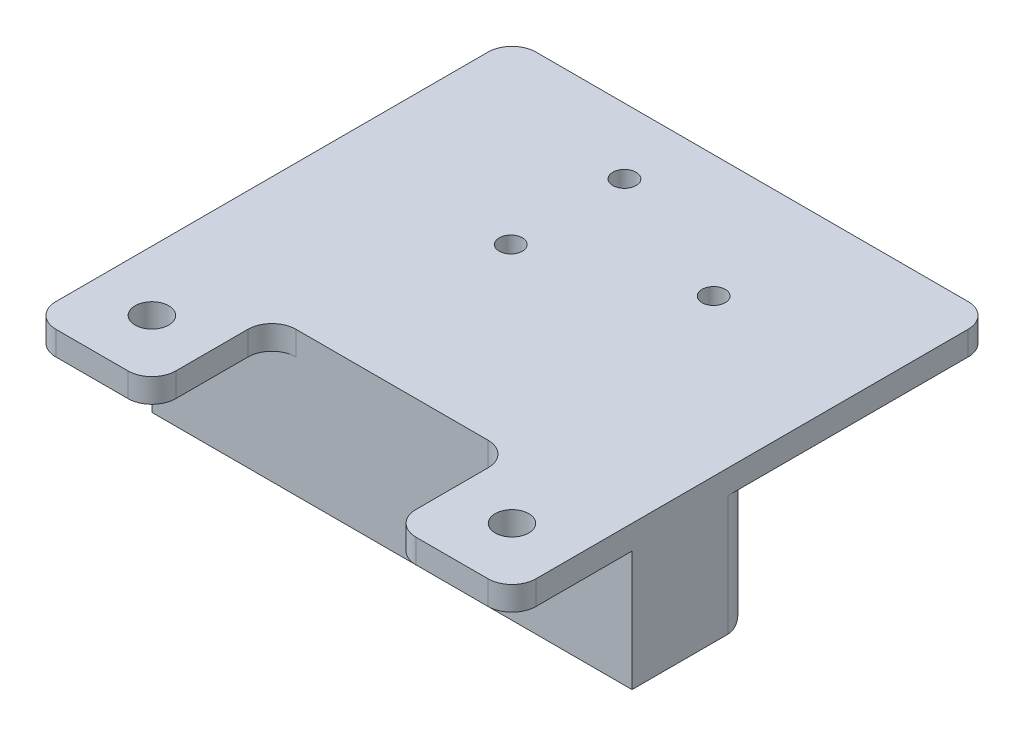
ISO-10303-21;
HEADER;
FILE_DESCRIPTION(('STEP AP214'),'2;1');
FILE_NAME('part.step','',(''),(''),'','','');
FILE_SCHEMA(('AUTOMOTIVE_DESIGN { 1 0 10303 214 1 1 1 1 }'));
ENDSEC;
DATA;
#1=APPLICATION_CONTEXT('core data for automotive mechanical design processes');
#2=APPLICATION_PROTOCOL_DEFINITION('international standard','automotive_design',2000,#1);
#3=PRODUCT_CONTEXT('',#1,'mechanical');
#4=PRODUCT('Part','Part','',(#3));
#5=PRODUCT_RELATED_PRODUCT_CATEGORY('part','',(#4));
#6=PRODUCT_DEFINITION_FORMATION('','',#4);
#7=PRODUCT_DEFINITION_CONTEXT('part definition',#1,'design');
#8=PRODUCT_DEFINITION('design','',#6,#7);
#9=PRODUCT_DEFINITION_SHAPE('','',#8);
#10=(LENGTH_UNIT() NAMED_UNIT(*) SI_UNIT(.MILLI.,.METRE.));
#11=(NAMED_UNIT(*) PLANE_ANGLE_UNIT() SI_UNIT($,.RADIAN.));
#12=(NAMED_UNIT(*) SI_UNIT($,.STERADIAN.) SOLID_ANGLE_UNIT());
#13=UNCERTAINTY_MEASURE_WITH_UNIT(LENGTH_MEASURE(1.E-05),#10,'distance_accuracy_value','');
#14=(GEOMETRIC_REPRESENTATION_CONTEXT(3) GLOBAL_UNCERTAINTY_ASSIGNED_CONTEXT((#13)) GLOBAL_UNIT_ASSIGNED_CONTEXT((#10,
#11,#12)) REPRESENTATION_CONTEXT('',''));
#15=CARTESIAN_POINT('',(0.,0.,0.));
#16=DIRECTION('',(0.,0.,1.));
#17=DIRECTION('',(1.,0.,0.));
#18=AXIS2_PLACEMENT_3D('',#15,#16,#17);
#19=CARTESIAN_POINT('',(0.,0.,0.));
#20=DIRECTION('',(0.,-1.,0.));
#21=DIRECTION('',(0.,0.,-1.));
#22=AXIS2_PLACEMENT_3D('',#19,#20,#21);
#23=PLANE('',#22);
#24=DIRECTION('',(0.,0.,-1.));
#25=VECTOR('',#24,1.);
#26=CARTESIAN_POINT('',(30.,0.,-52.5));
#27=LINE('',#26,#25);
#28=CARTESIAN_POINT('',(30.,0.,4.5));
#29=VERTEX_POINT('',#28);
#30=CARTESIAN_POINT('',(30.,0.,-7.49999999999999));
#31=VERTEX_POINT('',#30);
#32=EDGE_CURVE('E209',#29,#31,#27,.T.);
#33=ORIENTED_EDGE('',*,*,#32,.F.);
#34=CARTESIAN_POINT('',(27.,0.,4.5));
#35=DIRECTION('',(0.,-1.,0.));
#36=DIRECTION('',(0.,0.,-1.));
#37=AXIS2_PLACEMENT_3D('',#34,#35,#36);
#38=CIRCLE('',#37,3.);
#39=CARTESIAN_POINT('',(27.,0.,7.5));
#40=VERTEX_POINT('',#39);
#41=EDGE_CURVE('E340',#29,#40,#38,.T.);
#42=ORIENTED_EDGE('',*,*,#41,.T.);
#43=DIRECTION('',(1.,0.,0.));
#44=VECTOR('',#43,1.);
#45=CARTESIAN_POINT('',(30.,0.,7.5));
#46=LINE('',#45,#44);
#47=CARTESIAN_POINT('',(18.,0.,7.49999999999999));
#48=VERTEX_POINT('',#47);
#49=EDGE_CURVE('E290',#48,#40,#46,.T.);
#50=ORIENTED_EDGE('',*,*,#49,.F.);
#51=CARTESIAN_POINT('',(18.,0.,4.49999999999999));
#52=DIRECTION('',(0.,-1.,0.));
#53=DIRECTION('',(0.,0.,-1.));
#54=AXIS2_PLACEMENT_3D('',#51,#52,#53);
#55=CIRCLE('',#54,3.);
#56=CARTESIAN_POINT('',(15.,0.,4.5));
#57=VERTEX_POINT('',#56);
#58=EDGE_CURVE('E338',#48,#57,#55,.T.);
#59=ORIENTED_EDGE('',*,*,#58,.T.);
#60=DIRECTION('',(0.,0.,1.));
#61=VECTOR('',#60,1.);
#62=CARTESIAN_POINT('',(15.,0.,7.49999999999999));
#63=LINE('',#62,#61);
#64=CARTESIAN_POINT('',(15.,0.,-4.5));
#65=VERTEX_POINT('',#64);
#66=EDGE_CURVE('E287',#65,#57,#63,.T.);
#67=ORIENTED_EDGE('',*,*,#66,.F.);
#68=CARTESIAN_POINT('',(12.,0.,-4.5));
#69=DIRECTION('',(0.,-1.,0.));
#70=DIRECTION('',(0.,0.,-1.));
#71=AXIS2_PLACEMENT_3D('',#68,#69,#70);
#72=CIRCLE('',#71,3.);
#73=CARTESIAN_POINT('',(12.,0.,-7.5));
#74=VERTEX_POINT('',#73);
#75=EDGE_CURVE('E376',#65,#74,#72,.F.);
#76=ORIENTED_EDGE('',*,*,#75,.T.);
#77=DIRECTION('',(-1.,0.,0.));
#78=VECTOR('',#77,1.);
#79=CARTESIAN_POINT('',(-30.,0.,-7.49999999999999));
#80=LINE('',#79,#78);
#81=EDGE_CURVE('E58',#31,#74,#80,.T.);
#82=ORIENTED_EDGE('',*,*,#81,.F.);
#83=EDGE_LOOP('',(#33,#42,#50,#59,#67,#76,#82));
#84=FACE_BOUND('',#83,.T.);
#85=CARTESIAN_POINT('',(22.5,0.,0.));
#86=DIRECTION('',(0.,1.,0.));
#87=DIRECTION('',(0.,0.,-1.));
#88=AXIS2_PLACEMENT_3D('',#85,#86,#87);
#89=CIRCLE('',#88,2.1);
#90=CARTESIAN_POINT('',(22.5,0.,-2.1));
#91=VERTEX_POINT('',#90);
#92=EDGE_CURVE('E239',#91,#91,#89,.T.);
#93=ORIENTED_EDGE('',*,*,#92,.T.);
#94=EDGE_LOOP('',(#93));
#95=FACE_BOUND('',#94,.T.);
#96=ADVANCED_FACE('F41',(#84,#95),#23,.T.);
#97=DIRECTION('',(0.,0.,-1.));
#98=VECTOR('',#97,1.);
#99=CARTESIAN_POINT('',(-15.,0.,-7.5));
#100=LINE('',#99,#98);
#101=CARTESIAN_POINT('',(-15.,0.,4.5));
#102=VERTEX_POINT('',#101);
#103=CARTESIAN_POINT('',(-15.,0.,-4.5));
#104=VERTEX_POINT('',#103);
#105=EDGE_CURVE('E284',#102,#104,#100,.T.);
#106=ORIENTED_EDGE('',*,*,#105,.F.);
#107=CARTESIAN_POINT('',(-18.,0.,4.5));
#108=DIRECTION('',(0.,-1.,0.));
#109=DIRECTION('',(0.,0.,-1.));
#110=AXIS2_PLACEMENT_3D('',#107,#108,#109);
#111=CIRCLE('',#110,3.);
#112=CARTESIAN_POINT('',(-18.,0.,7.5));
#113=VERTEX_POINT('',#112);
#114=EDGE_CURVE('E359',#102,#113,#111,.T.);
#115=ORIENTED_EDGE('',*,*,#114,.T.);
#116=DIRECTION('',(1.,0.,0.));
#117=VECTOR('',#116,1.);
#118=CARTESIAN_POINT('',(-15.,0.,7.5));
#119=LINE('',#118,#117);
#120=CARTESIAN_POINT('',(-27.,0.,7.5));
#121=VERTEX_POINT('',#120);
#122=EDGE_CURVE('E281',#121,#113,#119,.T.);
#123=ORIENTED_EDGE('',*,*,#122,.F.);
#124=CARTESIAN_POINT('',(-27.,0.,4.5));
#125=DIRECTION('',(0.,-1.,0.));
#126=DIRECTION('',(0.,0.,-1.));
#127=AXIS2_PLACEMENT_3D('',#124,#125,#126);
#128=CIRCLE('',#127,3.);
#129=CARTESIAN_POINT('',(-30.,0.,4.5));
#130=VERTEX_POINT('',#129);
#131=EDGE_CURVE('E357',#121,#130,#128,.T.);
#132=ORIENTED_EDGE('',*,*,#131,.T.);
#133=DIRECTION('',(0.,0.,1.));
#134=VECTOR('',#133,1.);
#135=CARTESIAN_POINT('',(-30.,0.,7.5));
#136=LINE('',#135,#134);
#137=CARTESIAN_POINT('',(-30.,0.,-7.49999999999999));
#138=VERTEX_POINT('',#137);
#139=EDGE_CURVE('E251',#138,#130,#136,.T.);
#140=ORIENTED_EDGE('',*,*,#139,.F.);
#141=CARTESIAN_POINT('',(-12.,0.,-7.49999999999999));
#142=VERTEX_POINT('',#141);
#143=EDGE_CURVE('E66',#142,#138,#80,.T.);
#144=ORIENTED_EDGE('',*,*,#143,.F.);
#145=CARTESIAN_POINT('',(-12.,0.,-4.5));
#146=DIRECTION('',(0.,-1.,0.));
#147=DIRECTION('',(0.,0.,-1.));
#148=AXIS2_PLACEMENT_3D('',#145,#146,#147);
#149=CIRCLE('',#148,3.);
#150=EDGE_CURVE('E50',#142,#104,#149,.F.);
#151=ORIENTED_EDGE('',*,*,#150,.T.);
#152=EDGE_LOOP('',(#106,#115,#123,#132,#140,#144,#151));
#153=FACE_BOUND('',#152,.T.);
#154=CARTESIAN_POINT('',(-22.5,0.,0.));
#155=DIRECTION('',(0.,1.,0.));
#156=DIRECTION('',(0.,0.,1.));
#157=AXIS2_PLACEMENT_3D('',#154,#155,#156);
#158=CIRCLE('',#157,2.1);
#159=CARTESIAN_POINT('',(-22.5,0.,2.10000000000001));
#160=VERTEX_POINT('',#159);
#161=EDGE_CURVE('E245',#160,#160,#158,.T.);
#162=ORIENTED_EDGE('',*,*,#161,.T.);
#163=EDGE_LOOP('',(#162));
#164=FACE_BOUND('',#163,.T.);
#165=ADVANCED_FACE('F476',(#153,#164),#23,.T.);
#166=CARTESIAN_POINT('',(0.,3.,0.));
#167=DIRECTION('',(0.,-1.,0.));
#168=DIRECTION('',(0.,0.,-1.));
#169=AXIS2_PLACEMENT_3D('',#166,#167,#168);
#170=PLANE('',#169);
#171=DIRECTION('',(-1.,0.,0.));
#172=VECTOR('',#171,1.);
#173=CARTESIAN_POINT('',(-30.,3.,-52.5));
#174=LINE('',#173,#172);
#175=CARTESIAN_POINT('',(27.,3.,-52.5));
#176=VERTEX_POINT('',#175);
#177=CARTESIAN_POINT('',(-27.,3.,-52.5));
#178=VERTEX_POINT('',#177);
#179=EDGE_CURVE('E276',#176,#178,#174,.T.);
#180=ORIENTED_EDGE('',*,*,#179,.T.);
#181=CARTESIAN_POINT('',(-27.,3.,-49.5));
#182=DIRECTION('',(0.,-1.,0.));
#183=DIRECTION('',(0.,0.,-1.));
#184=AXIS2_PLACEMENT_3D('',#181,#182,#183);
#185=CIRCLE('',#184,3.);
#186=CARTESIAN_POINT('',(-30.,3.,-49.5));
#187=VERTEX_POINT('',#186);
#188=EDGE_CURVE('E336',#178,#187,#185,.F.);
#189=ORIENTED_EDGE('',*,*,#188,.T.);
#190=DIRECTION('',(0.,0.,1.));
#191=VECTOR('',#190,1.);
#192=CARTESIAN_POINT('',(-30.,3.,7.5));
#193=LINE('',#192,#191);
#194=CARTESIAN_POINT('',(-30.,3.,4.5));
#195=VERTEX_POINT('',#194);
#196=EDGE_CURVE('E254',#187,#195,#193,.T.);
#197=ORIENTED_EDGE('',*,*,#196,.T.);
#198=CARTESIAN_POINT('',(-27.,3.,4.5));
#199=DIRECTION('',(0.,-1.,0.));
#200=DIRECTION('',(0.,0.,-1.));
#201=AXIS2_PLACEMENT_3D('',#198,#199,#200);
#202=CIRCLE('',#201,3.);
#203=CARTESIAN_POINT('',(-27.,3.,7.5));
#204=VERTEX_POINT('',#203);
#205=EDGE_CURVE('E326',#195,#204,#202,.F.);
#206=ORIENTED_EDGE('',*,*,#205,.T.);
#207=DIRECTION('',(1.,0.,0.));
#208=VECTOR('',#207,1.);
#209=CARTESIAN_POINT('',(-15.,3.,7.5));
#210=LINE('',#209,#208);
#211=CARTESIAN_POINT('',(-18.,3.,7.5));
#212=VERTEX_POINT('',#211);
#213=EDGE_CURVE('E257',#204,#212,#210,.T.);
#214=ORIENTED_EDGE('',*,*,#213,.T.);
#215=CARTESIAN_POINT('',(-18.,3.,4.5));
#216=DIRECTION('',(0.,-1.,0.));
#217=DIRECTION('',(0.,0.,-1.));
#218=AXIS2_PLACEMENT_3D('',#215,#216,#217);
#219=CIRCLE('',#218,3.);
#220=CARTESIAN_POINT('',(-15.,3.,4.5));
#221=VERTEX_POINT('',#220);
#222=EDGE_CURVE('E328',#212,#221,#219,.F.);
#223=ORIENTED_EDGE('',*,*,#222,.T.);
#224=DIRECTION('',(0.,0.,-1.));
#225=VECTOR('',#224,1.);
#226=CARTESIAN_POINT('',(-15.,3.,-7.5));
#227=LINE('',#226,#225);
#228=CARTESIAN_POINT('',(-15.,3.,-4.5));
#229=VERTEX_POINT('',#228);
#230=EDGE_CURVE('E261',#221,#229,#227,.T.);
#231=ORIENTED_EDGE('',*,*,#230,.T.);
#232=CARTESIAN_POINT('',(-12.,3.,-4.5));
#233=DIRECTION('',(0.,-1.,0.));
#234=DIRECTION('',(0.,0.,-1.));
#235=AXIS2_PLACEMENT_3D('',#232,#233,#234);
#236=CIRCLE('',#235,3.);
#237=CARTESIAN_POINT('',(-12.,3.,-7.5));
#238=VERTEX_POINT('',#237);
#239=EDGE_CURVE('E11',#229,#238,#236,.T.);
#240=ORIENTED_EDGE('',*,*,#239,.T.);
#241=DIRECTION('',(1.,0.,0.));
#242=VECTOR('',#241,1.);
#243=CARTESIAN_POINT('',(15.,3.,-7.5));
#244=LINE('',#243,#242);
#245=CARTESIAN_POINT('',(12.,3.,-7.5));
#246=VERTEX_POINT('',#245);
#247=EDGE_CURVE('E264',#238,#246,#244,.T.);
#248=ORIENTED_EDGE('',*,*,#247,.T.);
#249=CARTESIAN_POINT('',(12.,3.,-4.5));
#250=DIRECTION('',(0.,-1.,0.));
#251=DIRECTION('',(0.,0.,-1.));
#252=AXIS2_PLACEMENT_3D('',#249,#250,#251);
#253=CIRCLE('',#252,3.);
#254=CARTESIAN_POINT('',(15.,3.,-4.5));
#255=VERTEX_POINT('',#254);
#256=EDGE_CURVE('E378',#246,#255,#253,.T.);
#257=ORIENTED_EDGE('',*,*,#256,.T.);
#258=DIRECTION('',(0.,0.,1.));
#259=VECTOR('',#258,1.);
#260=CARTESIAN_POINT('',(15.,3.,7.49999999999999));
#261=LINE('',#260,#259);
#262=CARTESIAN_POINT('',(15.,3.,4.5));
#263=VERTEX_POINT('',#262);
#264=EDGE_CURVE('E267',#255,#263,#261,.T.);
#265=ORIENTED_EDGE('',*,*,#264,.T.);
#266=CARTESIAN_POINT('',(18.,3.,4.49999999999999));
#267=DIRECTION('',(0.,-1.,0.));
#268=DIRECTION('',(0.,0.,-1.));
#269=AXIS2_PLACEMENT_3D('',#266,#267,#268);
#270=CIRCLE('',#269,3.);
#271=CARTESIAN_POINT('',(18.,3.,7.49999999999999));
#272=VERTEX_POINT('',#271);
#273=EDGE_CURVE('E330',#263,#272,#270,.F.);
#274=ORIENTED_EDGE('',*,*,#273,.T.);
#275=DIRECTION('',(1.,0.,0.));
#276=VECTOR('',#275,1.);
#277=CARTESIAN_POINT('',(30.,3.,7.5));
#278=LINE('',#277,#276);
#279=CARTESIAN_POINT('',(27.,3.,7.5));
#280=VERTEX_POINT('',#279);
#281=EDGE_CURVE('E270',#272,#280,#278,.T.);
#282=ORIENTED_EDGE('',*,*,#281,.T.);
#283=CARTESIAN_POINT('',(27.,3.,4.5));
#284=DIRECTION('',(0.,-1.,0.));
#285=DIRECTION('',(0.,0.,-1.));
#286=AXIS2_PLACEMENT_3D('',#283,#284,#285);
#287=CIRCLE('',#286,3.);
#288=CARTESIAN_POINT('',(30.,3.,4.5));
#289=VERTEX_POINT('',#288);
#290=EDGE_CURVE('E332',#280,#289,#287,.F.);
#291=ORIENTED_EDGE('',*,*,#290,.T.);
#292=DIRECTION('',(0.,0.,-1.));
#293=VECTOR('',#292,1.);
#294=CARTESIAN_POINT('',(30.,3.,-52.5));
#295=LINE('',#294,#293);
#296=CARTESIAN_POINT('',(30.,3.,-49.5));
#297=VERTEX_POINT('',#296);
#298=EDGE_CURVE('E273',#289,#297,#295,.T.);
#299=ORIENTED_EDGE('',*,*,#298,.T.);
#300=CARTESIAN_POINT('',(27.,3.,-49.5));
#301=DIRECTION('',(0.,-1.,0.));
#302=DIRECTION('',(0.,0.,-1.));
#303=AXIS2_PLACEMENT_3D('',#300,#301,#302);
#304=CIRCLE('',#303,3.);
#305=EDGE_CURVE('E334',#297,#176,#304,.F.);
#306=ORIENTED_EDGE('',*,*,#305,.T.);
#307=EDGE_LOOP('',(#180,#189,#197,#206,#214,#223,#231,#240,#248,#257,#265,#274,#282,#291,#299,#306));
#308=FACE_BOUND('',#307,.T.);
#309=CARTESIAN_POINT('',(-22.5,3.,0.));
#310=DIRECTION('',(0.,1.,0.));
#311=DIRECTION('',(0.,0.,1.));
#312=AXIS2_PLACEMENT_3D('',#309,#310,#311);
#313=CIRCLE('',#312,2.1);
#314=CARTESIAN_POINT('',(-22.5,3.,2.10000000000001));
#315=VERTEX_POINT('',#314);
#316=EDGE_CURVE('E248',#315,#315,#313,.T.);
#317=ORIENTED_EDGE('',*,*,#316,.F.);
#318=EDGE_LOOP('',(#317));
#319=FACE_BOUND('',#318,.T.);
#320=CARTESIAN_POINT('',(22.5,3.,0.));
#321=DIRECTION('',(0.,1.,0.));
#322=DIRECTION('',(0.,0.,-1.));
#323=AXIS2_PLACEMENT_3D('',#320,#321,#322);
#324=CIRCLE('',#323,2.1);
#325=CARTESIAN_POINT('',(22.5,3.,-2.1));
#326=VERTEX_POINT('',#325);
#327=EDGE_CURVE('E242',#326,#326,#324,.T.);
#328=ORIENTED_EDGE('',*,*,#327,.F.);
#329=EDGE_LOOP('',(#328));
#330=FACE_BOUND('',#329,.T.);
#331=CARTESIAN_POINT('',(-7.74999999999999,3.,-44.3));
#332=DIRECTION('',(0.,1.,0.));
#333=DIRECTION('',(0.,0.,1.));
#334=AXIS2_PLACEMENT_3D('',#331,#332,#333);
#335=CIRCLE('',#334,1.45);
#336=CARTESIAN_POINT('',(-7.74999999999999,3.,-42.85));
#337=VERTEX_POINT('',#336);
#338=EDGE_CURVE('E236',#337,#337,#335,.T.);
#339=ORIENTED_EDGE('',*,*,#338,.F.);
#340=EDGE_LOOP('',(#339));
#341=FACE_BOUND('',#340,.T.);
#342=CARTESIAN_POINT('',(10.5,3.,-37.2));
#343=DIRECTION('',(0.,1.,0.));
#344=DIRECTION('',(0.,0.,1.));
#345=AXIS2_PLACEMENT_3D('',#342,#343,#344);
#346=CIRCLE('',#345,1.45);
#347=CARTESIAN_POINT('',(10.5,3.,-35.75));
#348=VERTEX_POINT('',#347);
#349=EDGE_CURVE('E230',#348,#348,#346,.T.);
#350=ORIENTED_EDGE('',*,*,#349,.F.);
#351=EDGE_LOOP('',(#350));
#352=FACE_BOUND('',#351,.T.);
#353=CARTESIAN_POINT('',(-7.74999999999999,3.,-30.1));
#354=DIRECTION('',(0.,1.,0.));
#355=DIRECTION('',(0.,0.,1.));
#356=AXIS2_PLACEMENT_3D('',#353,#354,#355);
#357=CIRCLE('',#356,1.45);
#358=CARTESIAN_POINT('',(-7.74999999999999,3.,-28.65));
#359=VERTEX_POINT('',#358);
#360=EDGE_CURVE('E224',#359,#359,#357,.T.);
#361=ORIENTED_EDGE('',*,*,#360,.F.);
#362=EDGE_LOOP('',(#361));
#363=FACE_BOUND('',#362,.T.);
#364=ADVANCED_FACE('F413',(#308,#319,#330,#341,#352,#363),#170,.F.);
#365=CARTESIAN_POINT('',(-30.,0.,-49.5));
#366=VERTEX_POINT('',#365);
#367=CARTESIAN_POINT('',(-30.,0.,-19.5));
#368=VERTEX_POINT('',#367);
#369=EDGE_CURVE('E279',#366,#368,#136,.T.);
#370=ORIENTED_EDGE('',*,*,#369,.F.);
#371=CARTESIAN_POINT('',(-27.,0.,-49.5));
#372=DIRECTION('',(0.,-1.,0.));
#373=DIRECTION('',(0.,0.,-1.));
#374=AXIS2_PLACEMENT_3D('',#371,#372,#373);
#375=CIRCLE('',#374,3.);
#376=CARTESIAN_POINT('',(-27.,0.,-52.5));
#377=VERTEX_POINT('',#376);
#378=EDGE_CURVE('E319',#366,#377,#375,.T.);
#379=ORIENTED_EDGE('',*,*,#378,.T.);
#380=DIRECTION('',(-1.,0.,0.));
#381=VECTOR('',#380,1.);
#382=CARTESIAN_POINT('',(-30.,0.,-52.5));
#383=LINE('',#382,#381);
#384=CARTESIAN_POINT('',(27.,0.,-52.5));
#385=VERTEX_POINT('',#384);
#386=EDGE_CURVE('E258',#385,#377,#383,.T.);
#387=ORIENTED_EDGE('',*,*,#386,.F.);
#388=CARTESIAN_POINT('',(27.,0.,-49.5));
#389=DIRECTION('',(0.,-1.,0.));
#390=DIRECTION('',(0.,0.,-1.));
#391=AXIS2_PLACEMENT_3D('',#388,#389,#390);
#392=CIRCLE('',#391,3.);
#393=CARTESIAN_POINT('',(30.,0.,-49.5));
#394=VERTEX_POINT('',#393);
#395=EDGE_CURVE('E317',#385,#394,#392,.T.);
#396=ORIENTED_EDGE('',*,*,#395,.T.);
#397=CARTESIAN_POINT('',(30.,0.,-19.5));
#398=VERTEX_POINT('',#397);
#399=EDGE_CURVE('E293',#398,#394,#27,.T.);
#400=ORIENTED_EDGE('',*,*,#399,.F.);
#401=CARTESIAN_POINT('',(27.,0.,-19.5));
#402=DIRECTION('',(0.,-1.,0.));
#403=DIRECTION('',(0.,0.,-1.));
#404=AXIS2_PLACEMENT_3D('',#401,#402,#403);
#405=CIRCLE('',#404,3.);
#406=CARTESIAN_POINT('',(27.,0.,-22.5));
#407=VERTEX_POINT('',#406);
#408=EDGE_CURVE('E371',#398,#407,#405,.F.);
#409=ORIENTED_EDGE('',*,*,#408,.T.);
#410=DIRECTION('',(1.,0.,0.));
#411=VECTOR('',#410,1.);
#412=CARTESIAN_POINT('',(-30.,0.,-22.5));
#413=LINE('',#412,#411);
#414=CARTESIAN_POINT('',(-27.,0.,-22.5));
#415=VERTEX_POINT('',#414);
#416=EDGE_CURVE('E220',#415,#407,#413,.T.);
#417=ORIENTED_EDGE('',*,*,#416,.F.);
#418=CARTESIAN_POINT('',(-27.,0.,-19.5));
#419=DIRECTION('',(0.,-1.,0.));
#420=DIRECTION('',(0.,0.,-1.));
#421=AXIS2_PLACEMENT_3D('',#418,#419,#420);
#422=CIRCLE('',#421,3.);
#423=EDGE_CURVE('E373',#415,#368,#422,.F.);
#424=ORIENTED_EDGE('',*,*,#423,.T.);
#425=EDGE_LOOP('',(#370,#379,#387,#396,#400,#409,#417,#424));
#426=FACE_BOUND('',#425,.T.);
#427=CARTESIAN_POINT('',(10.5,0.,-37.2));
#428=DIRECTION('',(0.,1.,0.));
#429=DIRECTION('',(0.,0.,1.));
#430=AXIS2_PLACEMENT_3D('',#427,#428,#429);
#431=CIRCLE('',#430,1.45);
#432=CARTESIAN_POINT('',(10.5,0.,-35.75));
#433=VERTEX_POINT('',#432);
#434=EDGE_CURVE('E227',#433,#433,#431,.T.);
#435=ORIENTED_EDGE('',*,*,#434,.T.);
#436=EDGE_LOOP('',(#435));
#437=FACE_BOUND('',#436,.T.);
#438=CARTESIAN_POINT('',(-7.74999999999999,0.,-44.3));
#439=DIRECTION('',(0.,1.,0.));
#440=DIRECTION('',(0.,0.,1.));
#441=AXIS2_PLACEMENT_3D('',#438,#439,#440);
#442=CIRCLE('',#441,1.45);
#443=CARTESIAN_POINT('',(-7.74999999999999,0.,-42.85));
#444=VERTEX_POINT('',#443);
#445=EDGE_CURVE('E233',#444,#444,#442,.T.);
#446=ORIENTED_EDGE('',*,*,#445,.T.);
#447=EDGE_LOOP('',(#446));
#448=FACE_BOUND('',#447,.T.);
#449=CARTESIAN_POINT('',(-7.74999999999999,0.,-30.1));
#450=DIRECTION('',(0.,1.,0.));
#451=DIRECTION('',(0.,0.,1.));
#452=AXIS2_PLACEMENT_3D('',#449,#450,#451);
#453=CIRCLE('',#452,1.45);
#454=CARTESIAN_POINT('',(-7.74999999999999,0.,-28.65));
#455=VERTEX_POINT('',#454);
#456=EDGE_CURVE('E210',#455,#455,#453,.T.);
#457=ORIENTED_EDGE('',*,*,#456,.T.);
#458=EDGE_LOOP('',(#457));
#459=FACE_BOUND('',#458,.T.);
#460=ADVANCED_FACE('F400',(#426,#437,#448,#459),#23,.T.);
#461=CARTESIAN_POINT('',(-30.,3.,7.5));
#462=DIRECTION('',(1.,0.,0.));
#463=DIRECTION('',(0.,0.,-1.));
#464=AXIS2_PLACEMENT_3D('',#461,#462,#463);
#465=PLANE('',#464);
#466=ORIENTED_EDGE('',*,*,#369,.T.);
#467=DIRECTION('',(0.,1.,0.));
#468=VECTOR('',#467,1.);
#469=CARTESIAN_POINT('',(-30.,3.,-19.5));
#470=LINE('',#469,#468);
#471=CARTESIAN_POINT('',(-30.,-15.,-19.5));
#472=VERTEX_POINT('',#471);
#473=EDGE_CURVE('E314',#368,#472,#470,.F.);
#474=ORIENTED_EDGE('',*,*,#473,.T.);
#475=DIRECTION('',(0.,0.,-1.));
#476=VECTOR('',#475,1.);
#477=CARTESIAN_POINT('',(-30.,-15.,-7.49999999999999));
#478=LINE('',#477,#476);
#479=CARTESIAN_POINT('',(-30.,-15.,-7.49999999999999));
#480=VERTEX_POINT('',#479);
#481=EDGE_CURVE('E203',#480,#472,#478,.T.);
#482=ORIENTED_EDGE('',*,*,#481,.F.);
#483=DIRECTION('',(0.,1.,0.));
#484=VECTOR('',#483,1.);
#485=CARTESIAN_POINT('',(-30.,-15.,-7.49999999999999));
#486=LINE('',#485,#484);
#487=EDGE_CURVE('E211',#480,#138,#486,.T.);
#488=ORIENTED_EDGE('',*,*,#487,.T.);
#489=ORIENTED_EDGE('',*,*,#139,.T.);
#490=DIRECTION('',(0.,-1.,0.));
#491=VECTOR('',#490,1.);
#492=CARTESIAN_POINT('',(-30.,3.,4.5));
#493=LINE('',#492,#491);
#494=EDGE_CURVE('E309',#130,#195,#493,.F.);
#495=ORIENTED_EDGE('',*,*,#494,.T.);
#496=ORIENTED_EDGE('',*,*,#196,.F.);
#497=DIRECTION('',(0.,-1.,0.));
#498=VECTOR('',#497,1.);
#499=CARTESIAN_POINT('',(-30.,3.,-49.5));
#500=LINE('',#499,#498);
#501=EDGE_CURVE('E311',#187,#366,#500,.T.);
#502=ORIENTED_EDGE('',*,*,#501,.T.);
#503=EDGE_LOOP('',(#466,#474,#482,#488,#489,#495,#496,#502));
#504=FACE_BOUND('',#503,.T.);
#505=ADVANCED_FACE('F426',(#504),#465,.F.);
#506=CARTESIAN_POINT('',(-15.,3.,7.5));
#507=DIRECTION('',(0.,0.,-1.));
#508=DIRECTION('',(-1.,0.,0.));
#509=AXIS2_PLACEMENT_3D('',#506,#507,#508);
#510=PLANE('',#509);
#511=ORIENTED_EDGE('',*,*,#122,.T.);
#512=DIRECTION('',(0.,-1.,0.));
#513=VECTOR('',#512,1.);
#514=CARTESIAN_POINT('',(-18.,3.,7.5));
#515=LINE('',#514,#513);
#516=EDGE_CURVE('E364',#113,#212,#515,.F.);
#517=ORIENTED_EDGE('',*,*,#516,.T.);
#518=ORIENTED_EDGE('',*,*,#213,.F.);
#519=DIRECTION('',(0.,-1.,0.));
#520=VECTOR('',#519,1.);
#521=CARTESIAN_POINT('',(-27.,3.,7.5));
#522=LINE('',#521,#520);
#523=EDGE_CURVE('E361',#204,#121,#522,.T.);
#524=ORIENTED_EDGE('',*,*,#523,.T.);
#525=EDGE_LOOP('',(#511,#517,#518,#524));
#526=FACE_BOUND('',#525,.T.);
#527=ADVANCED_FACE('F435',(#526),#510,.F.);
#528=CARTESIAN_POINT('',(-15.,3.,-7.5));
#529=DIRECTION('',(-1.,0.,0.));
#530=DIRECTION('',(0.,0.,1.));
#531=AXIS2_PLACEMENT_3D('',#528,#529,#530);
#532=PLANE('',#531);
#533=ORIENTED_EDGE('',*,*,#230,.F.);
#534=DIRECTION('',(0.,-1.,0.));
#535=VECTOR('',#534,1.);
#536=CARTESIAN_POINT('',(-15.,3.,4.5));
#537=LINE('',#536,#535);
#538=EDGE_CURVE('E354',#221,#102,#537,.T.);
#539=ORIENTED_EDGE('',*,*,#538,.T.);
#540=ORIENTED_EDGE('',*,*,#105,.T.);
#541=DIRECTION('',(0.,-1.,0.));
#542=VECTOR('',#541,1.);
#543=CARTESIAN_POINT('',(-15.,3.,-4.5));
#544=LINE('',#543,#542);
#545=EDGE_CURVE('E352',#104,#229,#544,.F.);
#546=ORIENTED_EDGE('',*,*,#545,.T.);
#547=EDGE_LOOP('',(#533,#539,#540,#546));
#548=FACE_BOUND('',#547,.T.);
#549=ADVANCED_FACE('F444',(#548),#532,.F.);
#550=CARTESIAN_POINT('',(15.,3.,-7.5));
#551=DIRECTION('',(0.,0.,-1.));
#552=DIRECTION('',(-1.,0.,0.));
#553=AXIS2_PLACEMENT_3D('',#550,#551,#552);
#554=PLANE('',#553);
#555=ORIENTED_EDGE('',*,*,#81,.T.);
#556=DIRECTION('',(0.,-1.,0.));
#557=VECTOR('',#556,1.);
#558=CARTESIAN_POINT('',(12.,3.,-7.5));
#559=LINE('',#558,#557);
#560=EDGE_CURVE('E369',#74,#246,#559,.F.);
#561=ORIENTED_EDGE('',*,*,#560,.T.);
#562=ORIENTED_EDGE('',*,*,#247,.F.);
#563=DIRECTION('',(0.,-1.,0.));
#564=VECTOR('',#563,1.);
#565=CARTESIAN_POINT('',(-12.,0.,-7.5));
#566=LINE('',#565,#564);
#567=EDGE_CURVE('E366',#238,#142,#566,.T.);
#568=ORIENTED_EDGE('',*,*,#567,.T.);
#569=ORIENTED_EDGE('',*,*,#143,.T.);
#570=ORIENTED_EDGE('',*,*,#487,.F.);
#571=DIRECTION('',(-1.,0.,0.));
#572=VECTOR('',#571,1.);
#573=CARTESIAN_POINT('',(-30.,-15.,-7.49999999999999));
#574=LINE('',#573,#572);
#575=CARTESIAN_POINT('',(30.,-15.,-7.5));
#576=VERTEX_POINT('',#575);
#577=EDGE_CURVE('E196',#576,#480,#574,.T.);
#578=ORIENTED_EDGE('',*,*,#577,.F.);
#579=DIRECTION('',(0.,1.,0.));
#580=VECTOR('',#579,1.);
#581=CARTESIAN_POINT('',(30.,-15.,-7.5));
#582=LINE('',#581,#580);
#583=EDGE_CURVE('E205',#576,#31,#582,.T.);
#584=ORIENTED_EDGE('',*,*,#583,.T.);
#585=EDGE_LOOP('',(#555,#561,#562,#568,#569,#570,#578,#584));
#586=FACE_BOUND('',#585,.T.);
#587=ADVANCED_FACE('F213',(#586),#554,.F.);
#588=CARTESIAN_POINT('',(15.,3.,7.49999999999999));
#589=DIRECTION('',(1.,0.,0.));
#590=DIRECTION('',(0.,0.,-1.));
#591=AXIS2_PLACEMENT_3D('',#588,#589,#590);
#592=PLANE('',#591);
#593=ORIENTED_EDGE('',*,*,#66,.T.);
#594=DIRECTION('',(0.,-1.,0.));
#595=VECTOR('',#594,1.);
#596=CARTESIAN_POINT('',(15.,3.,4.5));
#597=LINE('',#596,#595);
#598=EDGE_CURVE('E350',#57,#263,#597,.F.);
#599=ORIENTED_EDGE('',*,*,#598,.T.);
#600=ORIENTED_EDGE('',*,*,#264,.F.);
#601=DIRECTION('',(0.,-1.,0.));
#602=VECTOR('',#601,1.);
#603=CARTESIAN_POINT('',(15.,0.,-4.5));
#604=LINE('',#603,#602);
#605=EDGE_CURVE('E347',#255,#65,#604,.T.);
#606=ORIENTED_EDGE('',*,*,#605,.T.);
#607=EDGE_LOOP('',(#593,#599,#600,#606));
#608=FACE_BOUND('',#607,.T.);
#609=ADVANCED_FACE('F458',(#608),#592,.F.);
#610=CARTESIAN_POINT('',(30.,3.,7.5));
#611=DIRECTION('',(0.,0.,-1.));
#612=DIRECTION('',(-1.,0.,0.));
#613=AXIS2_PLACEMENT_3D('',#610,#611,#612);
#614=PLANE('',#613);
#615=ORIENTED_EDGE('',*,*,#49,.T.);
#616=DIRECTION('',(0.,-1.,0.));
#617=VECTOR('',#616,1.);
#618=CARTESIAN_POINT('',(27.,3.,7.5));
#619=LINE('',#618,#617);
#620=EDGE_CURVE('E345',#40,#280,#619,.F.);
#621=ORIENTED_EDGE('',*,*,#620,.T.);
#622=ORIENTED_EDGE('',*,*,#281,.F.);
#623=DIRECTION('',(0.,-1.,0.));
#624=VECTOR('',#623,1.);
#625=CARTESIAN_POINT('',(18.,3.,7.49999999999999));
#626=LINE('',#625,#624);
#627=EDGE_CURVE('E342',#272,#48,#626,.T.);
#628=ORIENTED_EDGE('',*,*,#627,.T.);
#629=EDGE_LOOP('',(#615,#621,#622,#628));
#630=FACE_BOUND('',#629,.T.);
#631=ADVANCED_FACE('F467',(#630),#614,.F.);
#632=CARTESIAN_POINT('',(30.,3.,-52.5));
#633=DIRECTION('',(-1.,0.,0.));
#634=DIRECTION('',(0.,0.,1.));
#635=AXIS2_PLACEMENT_3D('',#632,#633,#634);
#636=PLANE('',#635);
#637=DIRECTION('',(0.,0.,1.));
#638=VECTOR('',#637,1.);
#639=CARTESIAN_POINT('',(30.,-15.,-7.5));
#640=LINE('',#639,#638);
#641=CARTESIAN_POINT('',(30.,-15.,-19.5));
#642=VERTEX_POINT('',#641);
#643=EDGE_CURVE('E191',#642,#576,#640,.T.);
#644=ORIENTED_EDGE('',*,*,#643,.F.);
#645=DIRECTION('',(0.,1.,0.));
#646=VECTOR('',#645,1.);
#647=CARTESIAN_POINT('',(30.,3.,-19.5));
#648=LINE('',#647,#646);
#649=EDGE_CURVE('E301',#642,#398,#648,.T.);
#650=ORIENTED_EDGE('',*,*,#649,.T.);
#651=ORIENTED_EDGE('',*,*,#399,.T.);
#652=DIRECTION('',(0.,-1.,0.));
#653=VECTOR('',#652,1.);
#654=CARTESIAN_POINT('',(30.,3.,-49.5));
#655=LINE('',#654,#653);
#656=EDGE_CURVE('E299',#394,#297,#655,.F.);
#657=ORIENTED_EDGE('',*,*,#656,.T.);
#658=ORIENTED_EDGE('',*,*,#298,.F.);
#659=DIRECTION('',(0.,-1.,0.));
#660=VECTOR('',#659,1.);
#661=CARTESIAN_POINT('',(30.,3.,4.5));
#662=LINE('',#661,#660);
#663=EDGE_CURVE('E297',#289,#29,#662,.T.);
#664=ORIENTED_EDGE('',*,*,#663,.T.);
#665=ORIENTED_EDGE('',*,*,#32,.T.);
#666=ORIENTED_EDGE('',*,*,#583,.F.);
#667=EDGE_LOOP('',(#644,#650,#651,#657,#658,#664,#665,#666));
#668=FACE_BOUND('',#667,.T.);
#669=ADVANCED_FACE('F206',(#668),#636,.F.);
#670=CARTESIAN_POINT('',(-30.,3.,-52.5));
#671=DIRECTION('',(0.,0.,1.));
#672=DIRECTION('',(1.,0.,0.));
#673=AXIS2_PLACEMENT_3D('',#670,#671,#672);
#674=PLANE('',#673);
#675=ORIENTED_EDGE('',*,*,#386,.T.);
#676=DIRECTION('',(0.,-1.,0.));
#677=VECTOR('',#676,1.);
#678=CARTESIAN_POINT('',(-27.,3.,-52.5));
#679=LINE('',#678,#677);
#680=EDGE_CURVE('E324',#377,#178,#679,.F.);
#681=ORIENTED_EDGE('',*,*,#680,.T.);
#682=ORIENTED_EDGE('',*,*,#179,.F.);
#683=DIRECTION('',(0.,-1.,0.));
#684=VECTOR('',#683,1.);
#685=CARTESIAN_POINT('',(27.,3.,-52.5));
#686=LINE('',#685,#684);
#687=EDGE_CURVE('E321',#176,#385,#686,.T.);
#688=ORIENTED_EDGE('',*,*,#687,.T.);
#689=EDGE_LOOP('',(#675,#681,#682,#688));
#690=FACE_BOUND('',#689,.T.);
#691=ADVANCED_FACE('F417',(#690),#674,.F.);
#692=CARTESIAN_POINT('',(-22.5,3.,0.));
#693=DIRECTION('',(0.,-1.,0.));
#694=DIRECTION('',(0.,0.,-1.));
#695=AXIS2_PLACEMENT_3D('',#692,#693,#694);
#696=CYLINDRICAL_SURFACE('',#695,2.1);
#697=ORIENTED_EDGE('',*,*,#316,.T.);
#698=EDGE_LOOP('',(#697));
#699=FACE_BOUND('',#698,.T.);
#700=ORIENTED_EDGE('',*,*,#161,.F.);
#701=EDGE_LOOP('',(#700));
#702=FACE_BOUND('',#701,.T.);
#703=ADVANCED_FACE('F483',(#699,#702),#696,.F.);
#704=CARTESIAN_POINT('',(22.5,3.,0.));
#705=DIRECTION('',(0.,-1.,0.));
#706=DIRECTION('',(0.,0.,-1.));
#707=AXIS2_PLACEMENT_3D('',#704,#705,#706);
#708=CYLINDRICAL_SURFACE('',#707,2.1);
#709=ORIENTED_EDGE('',*,*,#327,.T.);
#710=EDGE_LOOP('',(#709));
#711=FACE_BOUND('',#710,.T.);
#712=ORIENTED_EDGE('',*,*,#92,.F.);
#713=EDGE_LOOP('',(#712));
#714=FACE_BOUND('',#713,.T.);
#715=ADVANCED_FACE('F480',(#711,#714),#708,.F.);
#716=CARTESIAN_POINT('',(-7.74999999999999,3.,-44.3));
#717=DIRECTION('',(0.,-1.,0.));
#718=DIRECTION('',(0.,0.,-1.));
#719=AXIS2_PLACEMENT_3D('',#716,#717,#718);
#720=CYLINDRICAL_SURFACE('',#719,1.45);
#721=ORIENTED_EDGE('',*,*,#338,.T.);
#722=EDGE_LOOP('',(#721));
#723=FACE_BOUND('',#722,.T.);
#724=ORIENTED_EDGE('',*,*,#445,.F.);
#725=EDGE_LOOP('',(#724));
#726=FACE_BOUND('',#725,.T.);
#727=ADVANCED_FACE('F482',(#723,#726),#720,.F.);
#728=CARTESIAN_POINT('',(10.5,3.,-37.2));
#729=DIRECTION('',(0.,-1.,0.));
#730=DIRECTION('',(0.,0.,-1.));
#731=AXIS2_PLACEMENT_3D('',#728,#729,#730);
#732=CYLINDRICAL_SURFACE('',#731,1.45);
#733=ORIENTED_EDGE('',*,*,#349,.T.);
#734=EDGE_LOOP('',(#733));
#735=FACE_BOUND('',#734,.T.);
#736=ORIENTED_EDGE('',*,*,#434,.F.);
#737=EDGE_LOOP('',(#736));
#738=FACE_BOUND('',#737,.T.);
#739=ADVANCED_FACE('F490',(#735,#738),#732,.F.);
#740=CARTESIAN_POINT('',(-7.74999999999999,3.,-30.1));
#741=DIRECTION('',(0.,-1.,0.));
#742=DIRECTION('',(0.,0.,-1.));
#743=AXIS2_PLACEMENT_3D('',#740,#741,#742);
#744=CYLINDRICAL_SURFACE('',#743,1.45);
#745=ORIENTED_EDGE('',*,*,#360,.T.);
#746=EDGE_LOOP('',(#745));
#747=FACE_BOUND('',#746,.T.);
#748=ORIENTED_EDGE('',*,*,#456,.F.);
#749=EDGE_LOOP('',(#748));
#750=FACE_BOUND('',#749,.T.);
#751=ADVANCED_FACE('F615',(#747,#750),#744,.F.);
#752=CARTESIAN_POINT('',(-30.,-15.,-22.5));
#753=DIRECTION('',(0.,0.,1.));
#754=DIRECTION('',(1.,0.,0.));
#755=AXIS2_PLACEMENT_3D('',#752,#753,#754);
#756=PLANE('',#755);
#757=ORIENTED_EDGE('',*,*,#416,.T.);
#758=DIRECTION('',(0.,1.,0.));
#759=VECTOR('',#758,1.);
#760=CARTESIAN_POINT('',(27.,-15.,-22.5));
#761=LINE('',#760,#759);
#762=CARTESIAN_POINT('',(27.,-12.,-22.5));
#763=VERTEX_POINT('',#762);
#764=EDGE_CURVE('E307',#407,#763,#761,.F.);
#765=ORIENTED_EDGE('',*,*,#764,.T.);
#766=DIRECTION('',(1.,0.,0.));
#767=VECTOR('',#766,1.);
#768=CARTESIAN_POINT('',(-30.,-12.,-22.5));
#769=LINE('',#768,#767);
#770=CARTESIAN_POINT('',(-27.,-12.,-22.5));
#771=VERTEX_POINT('',#770);
#772=EDGE_CURVE('E303',#763,#771,#769,.F.);
#773=ORIENTED_EDGE('',*,*,#772,.T.);
#774=DIRECTION('',(0.,1.,0.));
#775=VECTOR('',#774,1.);
#776=CARTESIAN_POINT('',(-27.,-15.,-22.5));
#777=LINE('',#776,#775);
#778=EDGE_CURVE('E305',#771,#415,#777,.T.);
#779=ORIENTED_EDGE('',*,*,#778,.T.);
#780=EDGE_LOOP('',(#757,#765,#773,#779));
#781=FACE_BOUND('',#780,.T.);
#782=ADVANCED_FACE('F397',(#781),#756,.F.);
#783=CARTESIAN_POINT('',(0.,-15.,0.));
#784=DIRECTION('',(0.,-1.,0.));
#785=DIRECTION('',(0.,0.,-1.));
#786=AXIS2_PLACEMENT_3D('',#783,#784,#785);
#787=PLANE('',#786);
#788=ORIENTED_EDGE('',*,*,#481,.T.);
#789=DIRECTION('',(1.,0.,0.));
#790=VECTOR('',#789,1.);
#791=CARTESIAN_POINT('',(30.,-15.,-19.5));
#792=LINE('',#791,#790);
#793=EDGE_CURVE('E199',#472,#642,#792,.T.);
#794=ORIENTED_EDGE('',*,*,#793,.T.);
#795=ORIENTED_EDGE('',*,*,#643,.T.);
#796=ORIENTED_EDGE('',*,*,#577,.T.);
#797=EDGE_LOOP('',(#788,#794,#795,#796));
#798=FACE_BOUND('',#797,.T.);
#799=ADVANCED_FACE('F194',(#798),#787,.T.);
#800=CARTESIAN_POINT('',(-27.,-15.,-19.5));
#801=DIRECTION('',(0.,1.,0.));
#802=DIRECTION('',(0.,0.,1.));
#803=AXIS2_PLACEMENT_3D('',#800,#801,#802);
#804=CYLINDRICAL_SURFACE('',#803,3.);
#805=ORIENTED_EDGE('',*,*,#423,.F.);
#806=ORIENTED_EDGE('',*,*,#778,.F.);
#807=CARTESIAN_POINT('',(-27.,-12.,-19.5));
#808=DIRECTION('',(-0.707106781186547,0.707106781186547,0.));
#809=DIRECTION('',(-0.707106781186547,-0.707106781186547,0.));
#810=AXIS2_PLACEMENT_3D('',#807,#808,#809);
#811=ELLIPSE('',#810,4.24264068711928,3.);
#812=EDGE_CURVE('E45',#472,#771,#811,.F.);
#813=ORIENTED_EDGE('',*,*,#812,.F.);
#814=ORIENTED_EDGE('',*,*,#473,.F.);
#815=EDGE_LOOP('',(#805,#806,#813,#814));
#816=FACE_BOUND('',#815,.T.);
#817=ADVANCED_FACE('F394',(#816),#804,.T.);
#818=CARTESIAN_POINT('',(0.,-12.,-19.5));
#819=DIRECTION('',(-1.,0.,0.));
#820=DIRECTION('',(0.,0.,1.));
#821=AXIS2_PLACEMENT_3D('',#818,#819,#820);
#822=CYLINDRICAL_SURFACE('',#821,3.);
#823=ORIENTED_EDGE('',*,*,#812,.T.);
#824=ORIENTED_EDGE('',*,*,#772,.F.);
#825=CARTESIAN_POINT('',(27.,-12.,-19.5));
#826=DIRECTION('',(-0.707106781186547,-0.707106781186547,0.));
#827=DIRECTION('',(-0.707106781186547,0.707106781186547,0.));
#828=AXIS2_PLACEMENT_3D('',#825,#826,#827);
#829=ELLIPSE('',#828,4.24264068711928,3.);
#830=EDGE_CURVE('E380',#642,#763,#829,.F.);
#831=ORIENTED_EDGE('',*,*,#830,.F.);
#832=ORIENTED_EDGE('',*,*,#793,.F.);
#833=EDGE_LOOP('',(#823,#824,#831,#832));
#834=FACE_BOUND('',#833,.T.);
#835=ADVANCED_FACE('F389',(#834),#822,.T.);
#836=CARTESIAN_POINT('',(27.,3.,-19.5));
#837=DIRECTION('',(0.,1.,0.));
#838=DIRECTION('',(0.,0.,1.));
#839=AXIS2_PLACEMENT_3D('',#836,#837,#838);
#840=CYLINDRICAL_SURFACE('',#839,3.);
#841=ORIENTED_EDGE('',*,*,#830,.T.);
#842=ORIENTED_EDGE('',*,*,#764,.F.);
#843=ORIENTED_EDGE('',*,*,#408,.F.);
#844=ORIENTED_EDGE('',*,*,#649,.F.);
#845=EDGE_LOOP('',(#841,#842,#843,#844));
#846=FACE_BOUND('',#845,.T.);
#847=ADVANCED_FACE('F404',(#846),#840,.T.);
#848=CARTESIAN_POINT('',(-27.,3.,-49.5));
#849=DIRECTION('',(0.,-1.,0.));
#850=DIRECTION('',(0.,0.,-1.));
#851=AXIS2_PLACEMENT_3D('',#848,#849,#850);
#852=CYLINDRICAL_SURFACE('',#851,3.);
#853=ORIENTED_EDGE('',*,*,#188,.F.);
#854=ORIENTED_EDGE('',*,*,#680,.F.);
#855=ORIENTED_EDGE('',*,*,#378,.F.);
#856=ORIENTED_EDGE('',*,*,#501,.F.);
#857=EDGE_LOOP('',(#853,#854,#855,#856));
#858=FACE_BOUND('',#857,.T.);
#859=ADVANCED_FACE('F421',(#858),#852,.T.);
#860=CARTESIAN_POINT('',(27.,3.,-49.5));
#861=DIRECTION('',(0.,-1.,0.));
#862=DIRECTION('',(0.,0.,-1.));
#863=AXIS2_PLACEMENT_3D('',#860,#861,#862);
#864=CYLINDRICAL_SURFACE('',#863,3.);
#865=ORIENTED_EDGE('',*,*,#305,.F.);
#866=ORIENTED_EDGE('',*,*,#656,.F.);
#867=ORIENTED_EDGE('',*,*,#395,.F.);
#868=ORIENTED_EDGE('',*,*,#687,.F.);
#869=EDGE_LOOP('',(#865,#866,#867,#868));
#870=FACE_BOUND('',#869,.T.);
#871=ADVANCED_FACE('F409',(#870),#864,.T.);
#872=CARTESIAN_POINT('',(27.,3.,4.5));
#873=DIRECTION('',(0.,-1.,0.));
#874=DIRECTION('',(0.,0.,-1.));
#875=AXIS2_PLACEMENT_3D('',#872,#873,#874);
#876=CYLINDRICAL_SURFACE('',#875,3.);
#877=ORIENTED_EDGE('',*,*,#290,.F.);
#878=ORIENTED_EDGE('',*,*,#620,.F.);
#879=ORIENTED_EDGE('',*,*,#41,.F.);
#880=ORIENTED_EDGE('',*,*,#663,.F.);
#881=EDGE_LOOP('',(#877,#878,#879,#880));
#882=FACE_BOUND('',#881,.T.);
#883=ADVANCED_FACE('F471',(#882),#876,.T.);
#884=CARTESIAN_POINT('',(18.,3.,4.49999999999999));
#885=DIRECTION('',(0.,-1.,0.));
#886=DIRECTION('',(0.,0.,-1.));
#887=AXIS2_PLACEMENT_3D('',#884,#885,#886);
#888=CYLINDRICAL_SURFACE('',#887,3.);
#889=ORIENTED_EDGE('',*,*,#273,.F.);
#890=ORIENTED_EDGE('',*,*,#598,.F.);
#891=ORIENTED_EDGE('',*,*,#58,.F.);
#892=ORIENTED_EDGE('',*,*,#627,.F.);
#893=EDGE_LOOP('',(#889,#890,#891,#892));
#894=FACE_BOUND('',#893,.T.);
#895=ADVANCED_FACE('F462',(#894),#888,.T.);
#896=CARTESIAN_POINT('',(-18.,3.,4.5));
#897=DIRECTION('',(0.,-1.,0.));
#898=DIRECTION('',(0.,0.,-1.));
#899=AXIS2_PLACEMENT_3D('',#896,#897,#898);
#900=CYLINDRICAL_SURFACE('',#899,3.);
#901=ORIENTED_EDGE('',*,*,#222,.F.);
#902=ORIENTED_EDGE('',*,*,#516,.F.);
#903=ORIENTED_EDGE('',*,*,#114,.F.);
#904=ORIENTED_EDGE('',*,*,#538,.F.);
#905=EDGE_LOOP('',(#901,#902,#903,#904));
#906=FACE_BOUND('',#905,.T.);
#907=ADVANCED_FACE('F439',(#906),#900,.T.);
#908=CARTESIAN_POINT('',(-27.,3.,4.5));
#909=DIRECTION('',(0.,-1.,0.));
#910=DIRECTION('',(0.,0.,-1.));
#911=AXIS2_PLACEMENT_3D('',#908,#909,#910);
#912=CYLINDRICAL_SURFACE('',#911,3.);
#913=ORIENTED_EDGE('',*,*,#205,.F.);
#914=ORIENTED_EDGE('',*,*,#494,.F.);
#915=ORIENTED_EDGE('',*,*,#131,.F.);
#916=ORIENTED_EDGE('',*,*,#523,.F.);
#917=EDGE_LOOP('',(#913,#914,#915,#916));
#918=FACE_BOUND('',#917,.T.);
#919=ADVANCED_FACE('F430',(#918),#912,.T.);
#920=CARTESIAN_POINT('',(12.,3.,-4.5));
#921=DIRECTION('',(0.,1.,0.));
#922=DIRECTION('',(0.,0.,1.));
#923=AXIS2_PLACEMENT_3D('',#920,#921,#922);
#924=CYLINDRICAL_SURFACE('',#923,3.);
#925=ORIENTED_EDGE('',*,*,#256,.F.);
#926=ORIENTED_EDGE('',*,*,#560,.F.);
#927=ORIENTED_EDGE('',*,*,#75,.F.);
#928=ORIENTED_EDGE('',*,*,#605,.F.);
#929=EDGE_LOOP('',(#925,#926,#927,#928));
#930=FACE_BOUND('',#929,.T.);
#931=ADVANCED_FACE('F453',(#930),#924,.F.);
#932=CARTESIAN_POINT('',(-12.,3.,-4.5));
#933=DIRECTION('',(0.,1.,0.));
#934=DIRECTION('',(0.,0.,1.));
#935=AXIS2_PLACEMENT_3D('',#932,#933,#934);
#936=CYLINDRICAL_SURFACE('',#935,3.);
#937=ORIENTED_EDGE('',*,*,#239,.F.);
#938=ORIENTED_EDGE('',*,*,#545,.F.);
#939=ORIENTED_EDGE('',*,*,#150,.F.);
#940=ORIENTED_EDGE('',*,*,#567,.F.);
#941=EDGE_LOOP('',(#937,#938,#939,#940));
#942=FACE_BOUND('',#941,.T.);
#943=ADVANCED_FACE('F43',(#942),#936,.F.);
#944=CLOSED_SHELL('',(#96,#165,#364,#460,#505,#527,#549,#587,#609,#631,#669,#691,#703,#715,#727,
#739,#751,#782,#799,#817,#835,#847,#859,#871,#883,#895,#907,#919,#931,#943));
#945=MANIFOLD_SOLID_BREP('B2',#944);
#946=ADVANCED_BREP_SHAPE_REPRESENTATION('',(#18,#945),#14);
#947=SHAPE_DEFINITION_REPRESENTATION(#9,#946);
ENDSEC;
END-ISO-10303-21;
